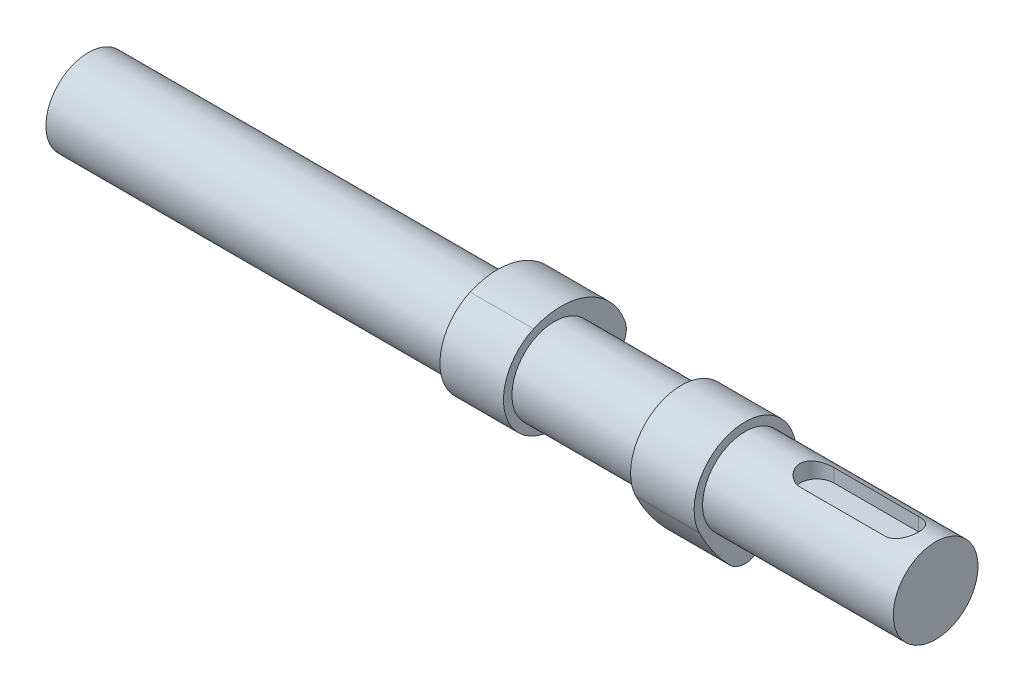
ISO-10303-21;
HEADER;
FILE_DESCRIPTION(('STEP AP214'),'2;1');
FILE_NAME('part.step','',(''),(''),'','','');
FILE_SCHEMA(('AUTOMOTIVE_DESIGN { 1 0 10303 214 1 1 1 1 }'));
ENDSEC;
DATA;
#1=APPLICATION_CONTEXT('core data for automotive mechanical design processes');
#2=APPLICATION_PROTOCOL_DEFINITION('international standard','automotive_design',2000,#1);
#3=PRODUCT_CONTEXT('',#1,'mechanical');
#4=PRODUCT('Part','Part','',(#3));
#5=PRODUCT_RELATED_PRODUCT_CATEGORY('part','',(#4));
#6=PRODUCT_DEFINITION_FORMATION('','',#4);
#7=PRODUCT_DEFINITION_CONTEXT('part definition',#1,'design');
#8=PRODUCT_DEFINITION('design','',#6,#7);
#9=PRODUCT_DEFINITION_SHAPE('','',#8);
#10=(LENGTH_UNIT() NAMED_UNIT(*) SI_UNIT(.MILLI.,.METRE.));
#11=(NAMED_UNIT(*) PLANE_ANGLE_UNIT() SI_UNIT($,.RADIAN.));
#12=(NAMED_UNIT(*) SI_UNIT($,.STERADIAN.) SOLID_ANGLE_UNIT());
#13=UNCERTAINTY_MEASURE_WITH_UNIT(LENGTH_MEASURE(1.E-05),#10,'distance_accuracy_value','');
#14=(GEOMETRIC_REPRESENTATION_CONTEXT(3) GLOBAL_UNCERTAINTY_ASSIGNED_CONTEXT((#13)) GLOBAL_UNIT_ASSIGNED_CONTEXT((#10,
#11,#12)) REPRESENTATION_CONTEXT('',''));
#15=CARTESIAN_POINT('',(0.,0.,0.));
#16=DIRECTION('',(0.,0.,1.));
#17=DIRECTION('',(1.,0.,0.));
#18=AXIS2_PLACEMENT_3D('',#15,#16,#17);
#19=CARTESIAN_POINT('',(30.,-1.62500000000004,3.65504787930334));
#20=DIRECTION('',(-1.,0.,0.));
#21=DIRECTION('',(0.,-1.,0.));
#22=AXIS2_PLACEMENT_3D('',#19,#20,#21);
#23=CYLINDRICAL_SURFACE('',#22,16.);
#24=CARTESIAN_POINT('',(15.,-1.62500000000004,3.65504787930334));
#25=DIRECTION('',(1.,0.,0.));
#26=DIRECTION('',(0.,1.,0.));
#27=AXIS2_PLACEMENT_3D('',#24,#25,#26);
#28=CIRCLE('',#27,16.);
#29=CARTESIAN_POINT('',(15.,-16.7159090909091,-1.66138539968352));
#30=VERTEX_POINT('',#29);
#31=CARTESIAN_POINT('',(15.,4.87500000000011,-10.96514363791));
#32=VERTEX_POINT('',#31);
#33=EDGE_CURVE('E118',#30,#32,#28,.T.);
#34=ORIENTED_EDGE('',*,*,#33,.T.);
#35=DIRECTION('',(-1.,0.,0.));
#36=VECTOR('',#35,1.);
#37=CARTESIAN_POINT('',(30.,4.87500000000011,-10.96514363791));
#38=LINE('',#37,#36);
#39=CARTESIAN_POINT('',(30.,4.87500000000011,-10.96514363791));
#40=VERTEX_POINT('',#39);
#41=EDGE_CURVE('E57',#40,#32,#38,.T.);
#42=ORIENTED_EDGE('',*,*,#41,.F.);
#43=CARTESIAN_POINT('',(30.,-1.62500000000004,3.65504787930334));
#44=DIRECTION('',(1.,0.,0.));
#45=DIRECTION('',(0.,1.,0.));
#46=AXIS2_PLACEMENT_3D('',#43,#44,#45);
#47=CIRCLE('',#46,16.);
#48=CARTESIAN_POINT('',(30.,-16.7159090909091,-1.66138539968352));
#49=VERTEX_POINT('',#48);
#50=EDGE_CURVE('E107',#49,#40,#47,.T.);
#51=ORIENTED_EDGE('',*,*,#50,.F.);
#52=DIRECTION('',(-1.,0.,0.));
#53=VECTOR('',#52,1.);
#54=CARTESIAN_POINT('',(30.,-16.7159090909091,-1.66138539968352));
#55=LINE('',#54,#53);
#56=EDGE_CURVE('E12',#49,#30,#55,.T.);
#57=ORIENTED_EDGE('',*,*,#56,.T.);
#58=EDGE_LOOP('',(#34,#42,#51,#57));
#59=FACE_BOUND('',#58,.T.);
#60=ADVANCED_FACE('F54',(#59),#23,.T.);
#61=CARTESIAN_POINT('',(30.,-12.,-1.25693328198353E-13));
#62=DIRECTION('',(-1.,0.,0.));
#63=DIRECTION('',(0.,-1.,0.));
#64=AXIS2_PLACEMENT_3D('',#61,#62,#63);
#65=CYLINDRICAL_SURFACE('',#64,5.);
#66=CARTESIAN_POINT('',(15.,-12.,-1.25693328198353E-13));
#67=DIRECTION('',(1.,0.,0.));
#68=DIRECTION('',(0.,-1.,0.));
#69=AXIS2_PLACEMENT_3D('',#66,#67,#68);
#70=CIRCLE('',#69,5.);
#71=CARTESIAN_POINT('',(15.,-15.4821428571429,3.5881305888231));
#72=VERTEX_POINT('',#71);
#73=EDGE_CURVE('E95',#72,#30,#70,.T.);
#74=ORIENTED_EDGE('',*,*,#73,.T.);
#75=ORIENTED_EDGE('',*,*,#56,.F.);
#76=CARTESIAN_POINT('',(30.,-12.,-1.25693328198353E-13));
#77=DIRECTION('',(1.,0.,0.));
#78=DIRECTION('',(0.,-1.,0.));
#79=AXIS2_PLACEMENT_3D('',#76,#77,#78);
#80=CIRCLE('',#79,5.);
#81=CARTESIAN_POINT('',(30.,-15.4821428571429,3.5881305888231));
#82=VERTEX_POINT('',#81);
#83=EDGE_CURVE('E72',#82,#49,#80,.T.);
#84=ORIENTED_EDGE('',*,*,#83,.F.);
#85=DIRECTION('',(-1.,0.,0.));
#86=VECTOR('',#85,1.);
#87=CARTESIAN_POINT('',(30.,-15.4821428571429,3.5881305888231));
#88=LINE('',#87,#86);
#89=EDGE_CURVE('E63',#82,#72,#88,.T.);
#90=ORIENTED_EDGE('',*,*,#89,.T.);
#91=EDGE_LOOP('',(#74,#75,#84,#90));
#92=FACE_BOUND('',#91,.T.);
#93=ADVANCED_FACE('F124',(#92),#65,.T.);
#94=CARTESIAN_POINT('',(30.,12.3750000000003,-25.1169141217625));
#95=DIRECTION('',(-1.,0.,0.));
#96=DIRECTION('',(0.,-1.,0.));
#97=AXIS2_PLACEMENT_3D('',#94,#95,#96);
#98=CYLINDRICAL_SURFACE('',#97,40.);
#99=CARTESIAN_POINT('',(15.,12.3750000000003,-25.1169141217625));
#100=DIRECTION('',(1.,0.,0.));
#101=DIRECTION('',(0.,-1.,0.));
#102=AXIS2_PLACEMENT_3D('',#99,#100,#101);
#103=CIRCLE('',#102,40.);
#104=CARTESIAN_POINT('',(15.,-5.30357142857153,10.7643917664697));
#105=VERTEX_POINT('',#104);
#106=EDGE_CURVE('E89',#105,#72,#103,.T.);
#107=ORIENTED_EDGE('',*,*,#106,.T.);
#108=ORIENTED_EDGE('',*,*,#89,.F.);
#109=CARTESIAN_POINT('',(30.,12.3750000000003,-25.1169141217625));
#110=DIRECTION('',(1.,0.,0.));
#111=DIRECTION('',(0.,-1.,0.));
#112=AXIS2_PLACEMENT_3D('',#109,#110,#111);
#113=CIRCLE('',#112,40.);
#114=CARTESIAN_POINT('',(30.,-5.30357142857153,10.7643917664697));
#115=VERTEX_POINT('',#114);
#116=EDGE_CURVE('E105',#115,#82,#113,.T.);
#117=ORIENTED_EDGE('',*,*,#116,.F.);
#118=DIRECTION('',(-1.,0.,0.));
#119=VECTOR('',#118,1.);
#120=CARTESIAN_POINT('',(30.,-5.30357142857153,10.7643917664697));
#121=LINE('',#120,#119);
#122=EDGE_CURVE('E110',#115,#105,#121,.T.);
#123=ORIENTED_EDGE('',*,*,#122,.T.);
#124=EDGE_LOOP('',(#107,#108,#117,#123));
#125=FACE_BOUND('',#124,.T.);
#126=ADVANCED_FACE('F113',(#125),#98,.T.);
#127=CARTESIAN_POINT('',(30.,0.,0.));
#128=DIRECTION('',(-1.,0.,0.));
#129=DIRECTION('',(0.,-1.,0.));
#130=AXIS2_PLACEMENT_3D('',#127,#128,#129);
#131=CYLINDRICAL_SURFACE('',#130,12.);
#132=CARTESIAN_POINT('',(15.,0.,0.));
#133=DIRECTION('',(1.,0.,0.));
#134=DIRECTION('',(0.,-1.,0.));
#135=AXIS2_PLACEMENT_3D('',#132,#133,#134);
#136=CIRCLE('',#135,12.);
#137=EDGE_CURVE('E112',#32,#105,#136,.T.);
#138=ORIENTED_EDGE('',*,*,#137,.T.);
#139=ORIENTED_EDGE('',*,*,#122,.F.);
#140=CARTESIAN_POINT('',(30.,0.,0.));
#141=DIRECTION('',(1.,0.,0.));
#142=DIRECTION('',(0.,-1.,0.));
#143=AXIS2_PLACEMENT_3D('',#140,#141,#142);
#144=CIRCLE('',#143,12.);
#145=EDGE_CURVE('E102',#40,#115,#144,.T.);
#146=ORIENTED_EDGE('',*,*,#145,.F.);
#147=ORIENTED_EDGE('',*,*,#41,.T.);
#148=EDGE_LOOP('',(#138,#139,#146,#147));
#149=FACE_BOUND('',#148,.T.);
#150=ADVANCED_FACE('F111',(#149),#131,.T.);
#151=CARTESIAN_POINT('',(30.,-6.81250000000002,1.82752393965161));
#152=DIRECTION('',(1.,0.,0.));
#153=DIRECTION('',(0.,1.,0.));
#154=AXIS2_PLACEMENT_3D('',#151,#152,#153);
#155=PLANE('',#154);
#156=ORIENTED_EDGE('',*,*,#50,.T.);
#157=ORIENTED_EDGE('',*,*,#145,.T.);
#158=ORIENTED_EDGE('',*,*,#116,.T.);
#159=ORIENTED_EDGE('',*,*,#83,.T.);
#160=EDGE_LOOP('',(#156,#157,#158,#159));
#161=FACE_BOUND('',#160,.T.);
#162=ADVANCED_FACE('F103',(#161),#155,.T.);
#163=CARTESIAN_POINT('',(15.,-6.81250000000002,1.82752393965161));
#164=DIRECTION('',(1.,0.,0.));
#165=DIRECTION('',(0.,1.,0.));
#166=AXIS2_PLACEMENT_3D('',#163,#164,#165);
#167=PLANE('',#166);
#168=ORIENTED_EDGE('',*,*,#33,.F.);
#169=ORIENTED_EDGE('',*,*,#73,.F.);
#170=ORIENTED_EDGE('',*,*,#106,.F.);
#171=ORIENTED_EDGE('',*,*,#137,.F.);
#172=EDGE_LOOP('',(#168,#169,#170,#171));
#173=FACE_BOUND('',#172,.T.);
#174=ADVANCED_FACE('F127',(#173),#167,.F.);
#175=CLOSED_SHELL('',(#60,#93,#126,#150,#162,#174));
#176=MANIFOLD_SOLID_BREP('B2',#175);
#177=CARTESIAN_POINT('',(-30.,-3.65504787930336,-1.625));
#178=DIRECTION('',(1.,0.,0.));
#179=DIRECTION('',(0.,0.,-1.));
#180=AXIS2_PLACEMENT_3D('',#177,#178,#179);
#181=CYLINDRICAL_SURFACE('',#180,16.);
#182=CARTESIAN_POINT('',(-15.,-3.65504787930336,-1.625));
#183=DIRECTION('',(1.,0.,0.));
#184=DIRECTION('',(0.,0.,1.));
#185=AXIS2_PLACEMENT_3D('',#182,#183,#184);
#186=CIRCLE('',#185,16.);
#187=CARTESIAN_POINT('',(-15.,1.66138539968335,-16.7159090909091));
#188=VERTEX_POINT('',#187);
#189=CARTESIAN_POINT('',(-15.,10.9651436379101,4.875));
#190=VERTEX_POINT('',#189);
#191=EDGE_CURVE('E251',#188,#190,#186,.T.);
#192=ORIENTED_EDGE('',*,*,#191,.F.);
#193=DIRECTION('',(1.,0.,0.));
#194=VECTOR('',#193,1.);
#195=CARTESIAN_POINT('',(-30.,1.66138539968335,-16.7159090909091));
#196=LINE('',#195,#194);
#197=CARTESIAN_POINT('',(-30.,1.66138539968335,-16.7159090909091));
#198=VERTEX_POINT('',#197);
#199=EDGE_CURVE('E52',#198,#188,#196,.T.);
#200=ORIENTED_EDGE('',*,*,#199,.F.);
#201=CARTESIAN_POINT('',(-30.,-3.65504787930336,-1.625));
#202=DIRECTION('',(1.,0.,0.));
#203=DIRECTION('',(0.,0.,1.));
#204=AXIS2_PLACEMENT_3D('',#201,#202,#203);
#205=CIRCLE('',#204,16.);
#206=CARTESIAN_POINT('',(-30.,10.9651436379101,4.875));
#207=VERTEX_POINT('',#206);
#208=EDGE_CURVE('E245',#198,#207,#205,.T.);
#209=ORIENTED_EDGE('',*,*,#208,.T.);
#210=DIRECTION('',(1.,0.,0.));
#211=VECTOR('',#210,1.);
#212=CARTESIAN_POINT('',(-30.,10.9651436379101,4.875));
#213=LINE('',#212,#211);
#214=EDGE_CURVE('E190',#207,#190,#213,.T.);
#215=ORIENTED_EDGE('',*,*,#214,.T.);
#216=EDGE_LOOP('',(#192,#200,#209,#215));
#217=FACE_BOUND('',#216,.T.);
#218=ADVANCED_FACE('F187',(#217),#181,.T.);
#219=CARTESIAN_POINT('',(-30.,0.,-12.));
#220=DIRECTION('',(1.,0.,0.));
#221=DIRECTION('',(0.,0.,-1.));
#222=AXIS2_PLACEMENT_3D('',#219,#220,#221);
#223=CYLINDRICAL_SURFACE('',#222,5.);
#224=CARTESIAN_POINT('',(-15.,0.,-12.));
#225=DIRECTION('',(1.,0.,0.));
#226=DIRECTION('',(0.,0.,-1.));
#227=AXIS2_PLACEMENT_3D('',#224,#225,#226);
#228=CIRCLE('',#227,5.);
#229=CARTESIAN_POINT('',(-15.,-3.58813058882326,-15.4821428571428));
#230=VERTEX_POINT('',#229);
#231=EDGE_CURVE('E247',#230,#188,#228,.T.);
#232=ORIENTED_EDGE('',*,*,#231,.F.);
#233=DIRECTION('',(1.,0.,0.));
#234=VECTOR('',#233,1.);
#235=CARTESIAN_POINT('',(-30.,-3.58813058882326,-15.4821428571428));
#236=LINE('',#235,#234);
#237=CARTESIAN_POINT('',(-30.,-3.58813058882326,-15.4821428571428));
#238=VERTEX_POINT('',#237);
#239=EDGE_CURVE('E196',#238,#230,#236,.T.);
#240=ORIENTED_EDGE('',*,*,#239,.F.);
#241=CARTESIAN_POINT('',(-30.,0.,-12.));
#242=DIRECTION('',(1.,0.,0.));
#243=DIRECTION('',(0.,0.,-1.));
#244=AXIS2_PLACEMENT_3D('',#241,#242,#243);
#245=CIRCLE('',#244,5.);
#246=EDGE_CURVE('E242',#238,#198,#245,.T.);
#247=ORIENTED_EDGE('',*,*,#246,.T.);
#248=ORIENTED_EDGE('',*,*,#199,.T.);
#249=EDGE_LOOP('',(#232,#240,#247,#248));
#250=FACE_BOUND('',#249,.T.);
#251=ADVANCED_FACE('F261',(#250),#223,.T.);
#252=CARTESIAN_POINT('',(-30.,25.1169141217626,12.375));
#253=DIRECTION('',(1.,0.,0.));
#254=DIRECTION('',(0.,0.,-1.));
#255=AXIS2_PLACEMENT_3D('',#252,#253,#254);
#256=CYLINDRICAL_SURFACE('',#255,40.);
#257=CARTESIAN_POINT('',(-15.,25.1169141217626,12.375));
#258=DIRECTION('',(1.,0.,0.));
#259=DIRECTION('',(0.,0.,-1.));
#260=AXIS2_PLACEMENT_3D('',#257,#258,#259);
#261=CIRCLE('',#260,40.);
#262=CARTESIAN_POINT('',(-15.,-10.7643917664697,-5.30357142857142));
#263=VERTEX_POINT('',#262);
#264=EDGE_CURVE('E237',#263,#230,#261,.T.);
#265=ORIENTED_EDGE('',*,*,#264,.F.);
#266=DIRECTION('',(1.,0.,0.));
#267=VECTOR('',#266,1.);
#268=CARTESIAN_POINT('',(-30.,-10.7643917664697,-5.30357142857142));
#269=LINE('',#268,#267);
#270=CARTESIAN_POINT('',(-30.,-10.7643917664697,-5.30357142857142));
#271=VERTEX_POINT('',#270);
#272=EDGE_CURVE('E232',#271,#263,#269,.T.);
#273=ORIENTED_EDGE('',*,*,#272,.F.);
#274=CARTESIAN_POINT('',(-30.,25.1169141217626,12.375));
#275=DIRECTION('',(1.,0.,0.));
#276=DIRECTION('',(0.,0.,-1.));
#277=AXIS2_PLACEMENT_3D('',#274,#275,#276);
#278=CIRCLE('',#277,40.);
#279=EDGE_CURVE('E235',#271,#238,#278,.T.);
#280=ORIENTED_EDGE('',*,*,#279,.T.);
#281=ORIENTED_EDGE('',*,*,#239,.T.);
#282=EDGE_LOOP('',(#265,#273,#280,#281));
#283=FACE_BOUND('',#282,.T.);
#284=ADVANCED_FACE('F234',(#283),#256,.T.);
#285=CARTESIAN_POINT('',(-30.,0.,0.));
#286=DIRECTION('',(1.,0.,0.));
#287=DIRECTION('',(0.,0.,-1.));
#288=AXIS2_PLACEMENT_3D('',#285,#286,#287);
#289=CYLINDRICAL_SURFACE('',#288,12.);
#290=CARTESIAN_POINT('',(-15.,0.,0.));
#291=DIRECTION('',(1.,0.,0.));
#292=DIRECTION('',(0.,0.,-1.));
#293=AXIS2_PLACEMENT_3D('',#290,#291,#292);
#294=CIRCLE('',#293,12.);
#295=EDGE_CURVE('E254',#190,#263,#294,.T.);
#296=ORIENTED_EDGE('',*,*,#295,.F.);
#297=ORIENTED_EDGE('',*,*,#214,.F.);
#298=CARTESIAN_POINT('',(-30.,0.,0.));
#299=DIRECTION('',(1.,0.,0.));
#300=DIRECTION('',(0.,0.,-1.));
#301=AXIS2_PLACEMENT_3D('',#298,#299,#300);
#302=CIRCLE('',#301,12.);
#303=EDGE_CURVE('E241',#207,#271,#302,.T.);
#304=ORIENTED_EDGE('',*,*,#303,.T.);
#305=ORIENTED_EDGE('',*,*,#272,.T.);
#306=EDGE_LOOP('',(#296,#297,#304,#305));
#307=FACE_BOUND('',#306,.T.);
#308=ADVANCED_FACE('F244',(#307),#289,.T.);
#309=CARTESIAN_POINT('',(-30.,-1.82752393965168,-6.8125));
#310=DIRECTION('',(-1.,0.,0.));
#311=DIRECTION('',(0.,0.,1.));
#312=AXIS2_PLACEMENT_3D('',#309,#310,#311);
#313=PLANE('',#312);
#314=ORIENTED_EDGE('',*,*,#208,.F.);
#315=ORIENTED_EDGE('',*,*,#246,.F.);
#316=ORIENTED_EDGE('',*,*,#279,.F.);
#317=ORIENTED_EDGE('',*,*,#303,.F.);
#318=EDGE_LOOP('',(#314,#315,#316,#317));
#319=FACE_BOUND('',#318,.T.);
#320=ADVANCED_FACE('F240',(#319),#313,.T.);
#321=CARTESIAN_POINT('',(-15.,-1.82752393965168,-6.8125));
#322=DIRECTION('',(-1.,0.,0.));
#323=DIRECTION('',(0.,0.,1.));
#324=AXIS2_PLACEMENT_3D('',#321,#322,#323);
#325=PLANE('',#324);
#326=ORIENTED_EDGE('',*,*,#191,.T.);
#327=ORIENTED_EDGE('',*,*,#295,.T.);
#328=ORIENTED_EDGE('',*,*,#264,.T.);
#329=ORIENTED_EDGE('',*,*,#231,.T.);
#330=EDGE_LOOP('',(#326,#327,#328,#329));
#331=FACE_BOUND('',#330,.T.);
#332=ADVANCED_FACE('F260',(#331),#325,.F.);
#333=CLOSED_SHELL('',(#218,#251,#284,#308,#320,#332));
#334=MANIFOLD_SOLID_BREP('B6',#333);
#335=CARTESIAN_POINT('',(-125.,0.,0.));
#336=DIRECTION('',(1.,0.,0.));
#337=DIRECTION('',(0.,0.,-1.));
#338=AXIS2_PLACEMENT_3D('',#335,#336,#337);
#339=CYLINDRICAL_SURFACE('',#338,10.);
#340=CARTESIAN_POINT('',(67.,9.16515138991168,4.));
#341=CARTESIAN_POINT('',(67.1076117050542,9.16512928809544,4.00001596071937));
#342=CARTESIAN_POINT('',(67.2152113311667,9.16704612011429,3.99565782731265));
#343=CARTESIAN_POINT('',(67.4295425965387,9.17459250745478,3.97831811946459));
#344=CARTESIAN_POINT('',(67.5362745507169,9.18022064873058,3.96533982937531));
#345=CARTESIAN_POINT('',(67.7476936431063,9.19499565865171,3.93095207352899));
#346=CARTESIAN_POINT('',(67.852387168085,9.20412861441611,3.90957593640916));
#347=CARTESIAN_POINT('',(68.0594015434319,9.22560106586818,3.85863260381273));
#348=CARTESIAN_POINT('',(68.1617222485551,9.23794075728508,3.82906490834148));
#349=CARTESIAN_POINT('',(68.4638717011625,9.2791858250141,3.72853943587112));
#350=CARTESIAN_POINT('',(68.6593084613828,9.3123489831615,3.64568978920222));
#351=CARTESIAN_POINT('',(69.0335911601619,9.38624741529469,3.45096383184147));
#352=CARTESIAN_POINT('',(69.2124211059086,9.42698987727425,3.33905992673094));
#353=CARTESIAN_POINT('',(69.558524793364,9.51401998804847,3.08263671474506));
#354=CARTESIAN_POINT('',(69.7247344339004,9.56048491272144,2.936738279885));
#355=CARTESIAN_POINT('',(70.0310805443615,9.65225581096199,2.61939292349377));
#356=CARTESIAN_POINT('',(70.1712116615072,9.69756154495612,2.44794076987998));
#357=CARTESIAN_POINT('',(70.4268127886244,9.78406834216144,2.07601181629753));
#358=CARTESIAN_POINT('',(70.5410896194101,9.82503649102096,1.87465586655102));
#359=CARTESIAN_POINT('',(70.7336881444914,9.89607888234979,1.45364828604453));
#360=CARTESIAN_POINT('',(70.8120248447933,9.92615767032247,1.23400433637531));
#361=CARTESIAN_POINT('',(70.9266824057709,9.97076629361036,0.793934884187374));
#362=CARTESIAN_POINT('',(70.9648539133031,9.98597845290694,0.574062114869026));
#363=CARTESIAN_POINT('',(71.0040569484035,10.001606202074,0.130536855092208));
#364=CARTESIAN_POINT('',(71.0051016332518,10.0020270338048,-0.0931142682526755));
#365=CARTESIAN_POINT('',(70.9710343620717,9.98843920775428,-0.52446673198723));
#366=CARTESIAN_POINT('',(70.9379500534468,9.97523973659776,-0.732358330632752));
#367=CARTESIAN_POINT('',(70.8400129990898,9.93698538393896,-1.13934964738689));
#368=CARTESIAN_POINT('',(70.7751584554296,9.91192983148495,-1.33844886722559));
#369=CARTESIAN_POINT('',(70.614727962228,9.85193670608706,-1.72579479688348));
#370=CARTESIAN_POINT('',(70.518703604161,9.81685584875391,-1.91383264586891));
#371=CARTESIAN_POINT('',(70.2990687362952,9.74029168639969,-2.2716159956307));
#372=CARTESIAN_POINT('',(70.1754485485622,9.69880613681324,-2.4413550479227));
#373=CARTESIAN_POINT('',(69.8947199425636,9.61043706268122,-2.7695225783069));
#374=CARTESIAN_POINT('',(69.7359469828836,9.56337795745419,-2.92647922614483));
#375=CARTESIAN_POINT('',(69.3940078633372,9.47123359153046,-3.2122147086262));
#376=CARTESIAN_POINT('',(69.2108306512004,9.42614923753061,-3.34098070594789));
#377=CARTESIAN_POINT('',(68.9183643543766,9.36326134539254,-3.51186134851389));
#378=CARTESIAN_POINT('',(68.8163281616851,9.34283170142194,-3.56571263251516));
#379=CARTESIAN_POINT('',(68.6076076975908,9.30450957703984,-3.6645476150566));
#380=CARTESIAN_POINT('',(68.5009254542727,9.28661600381593,-3.70953513634087));
#381=CARTESIAN_POINT('',(68.2837710695037,9.2540025053992,-3.79016254319008));
#382=CARTESIAN_POINT('',(68.1733038299586,9.2392786427695,-3.82581403809399));
#383=CARTESIAN_POINT('',(67.9493316318513,9.2135146773091,-3.88744848158464));
#384=CARTESIAN_POINT('',(67.8358280597875,9.20247292309662,-3.91343576505912));
#385=CARTESIAN_POINT('',(67.6025545526625,9.18417798205495,-3.95619393609846));
#386=CARTESIAN_POINT('',(67.4827058054362,9.17707470750586,-3.9726012558417));
#387=CARTESIAN_POINT('',(67.2419090708629,9.16754485606457,-3.99451448409732));
#388=CARTESIAN_POINT('',(67.1209618070773,9.16511539745838,-4.00002710996011));
#389=CARTESIAN_POINT('',(67.,9.16515138991168,-4.));
#390=B_SPLINE_CURVE_WITH_KNOTS('',3,(#340,#341,#342,#343,#344,#345,#346,#347,#348,#349,#350,
#351,#352,#353,#354,#355,#356,#357,#358,#359,#360,#361,#362,#363,#364,#365,#366,#367,#368,#369,
#370,#371,#372,#373,#374,#375,#376,#377,#378,#379,#380,#381,#382,#383,#384,#385,#386,#387,#388,
#389),.UNSPECIFIED.,.F.,.F.,(4,2,2,2,2,2,2,2,2,2,2,2,2,2,2,2,2,2,2,2,2,2,2,2,4),(0.,
0.322709706217834,0.645296527806424,0.96661582254376,1.28795473422461,1.92936600351818,
2.57138869889252,3.24636095994996,3.92147161082381,4.62325717855527,5.32474946398644,
5.99227753012539,6.65956903033311,7.2893783052307,7.91922322615308,8.55856353859092,
9.19812842270037,9.87963749353244,10.5614562641081,10.9125878460839,11.2635676597188,
11.614108935291,11.964492785171,12.3274303244848,12.6901440171997),.UNSPECIFIED.);
#391=CARTESIAN_POINT('',(67.,9.16515138991165,4.));
#392=VERTEX_POINT('',#391);
#393=CARTESIAN_POINT('',(67.,9.16515138991168,-4.));
#394=VERTEX_POINT('',#393);
#395=EDGE_CURVE('E397',#392,#394,#390,.T.);
#396=ORIENTED_EDGE('',*,*,#395,.F.);
#397=DIRECTION('',(1.,0.,0.));
#398=VECTOR('',#397,1.);
#399=CARTESIAN_POINT('',(-125.,9.16515138991165,4.00000000000006));
#400=LINE('',#399,#398);
#401=CARTESIAN_POINT('',(47.,9.16515138991168,4.));
#402=VERTEX_POINT('',#401);
#403=EDGE_CURVE('E185',#402,#392,#400,.T.);
#404=ORIENTED_EDGE('',*,*,#403,.F.);
#405=CARTESIAN_POINT('',(47.,9.16515138991168,-4.));
#406=CARTESIAN_POINT('',(46.8923882949459,9.16512928809544,-4.00001596071937));
#407=CARTESIAN_POINT('',(46.7847886688333,9.16704612011429,-3.99565782731265));
#408=CARTESIAN_POINT('',(46.5704574034613,9.17459250745478,-3.9783181194646));
#409=CARTESIAN_POINT('',(46.4637254492831,9.18022064873058,-3.96533982937531));
#410=CARTESIAN_POINT('',(46.2523063568937,9.19499565865171,-3.93095207352899));
#411=CARTESIAN_POINT('',(46.147612831915,9.20412861441611,-3.90957593640916));
#412=CARTESIAN_POINT('',(45.9405984565681,9.22560106586818,-3.85863260381273));
#413=CARTESIAN_POINT('',(45.8382777514449,9.23794075728508,-3.82906490834147));
#414=CARTESIAN_POINT('',(45.5361282988375,9.2791858250141,-3.72853943587111));
#415=CARTESIAN_POINT('',(45.3406915386172,9.3123489831615,-3.64568978920222));
#416=CARTESIAN_POINT('',(44.9664088398381,9.38624741529469,-3.45096383184147));
#417=CARTESIAN_POINT('',(44.7875788940914,9.42698987727426,-3.33905992673093));
#418=CARTESIAN_POINT('',(44.441475206636,9.51401998804847,-3.08263671474505));
#419=CARTESIAN_POINT('',(44.2752655660996,9.56048491272144,-2.936738279885));
#420=CARTESIAN_POINT('',(43.9689194556385,9.65225581096199,-2.61939292349377));
#421=CARTESIAN_POINT('',(43.8287883384928,9.69756154495612,-2.44794076987997));
#422=CARTESIAN_POINT('',(43.5731872113755,9.78406834216145,-2.07601181629752));
#423=CARTESIAN_POINT('',(43.4589103805898,9.82503649102096,-1.87465586655101));
#424=CARTESIAN_POINT('',(43.2663118555086,9.89607888234979,-1.45364828604452));
#425=CARTESIAN_POINT('',(43.1879751552067,9.92615767032247,-1.2340043363753));
#426=CARTESIAN_POINT('',(43.0733175942291,9.97076629361036,-0.793934884187364));
#427=CARTESIAN_POINT('',(43.0351460866969,9.98597845290694,-0.574062114869015));
#428=CARTESIAN_POINT('',(42.9959430515965,10.001606202074,-0.130536855092197));
#429=CARTESIAN_POINT('',(42.9948983667482,10.0020270338048,0.0931142682526862));
#430=CARTESIAN_POINT('',(43.0289656379282,9.98843920775428,0.524466731987239));
#431=CARTESIAN_POINT('',(43.0620499465532,9.97523973659776,0.732358330632759));
#432=CARTESIAN_POINT('',(43.1599870009102,9.93698538393896,1.13934964738689));
#433=CARTESIAN_POINT('',(43.2248415445704,9.91192983148495,1.33844886722559));
#434=CARTESIAN_POINT('',(43.3852720377719,9.85193670608706,1.72579479688349));
#435=CARTESIAN_POINT('',(43.4812963958391,9.81685584875391,1.91383264586892));
#436=CARTESIAN_POINT('',(43.7009312637048,9.74029168639969,2.27161599563072));
#437=CARTESIAN_POINT('',(43.8245514514379,9.69880613681324,2.44135504792271));
#438=CARTESIAN_POINT('',(44.1052800574364,9.61043706268122,2.76952257830691));
#439=CARTESIAN_POINT('',(44.2640530171164,9.56337795745419,2.92647922614484));
#440=CARTESIAN_POINT('',(44.6059921366628,9.47123359153046,3.21221470862621));
#441=CARTESIAN_POINT('',(44.7891693487996,9.42614923753061,3.34098070594789));
#442=CARTESIAN_POINT('',(45.0816356456234,9.36326134539254,3.5118613485139));
#443=CARTESIAN_POINT('',(45.1836718383149,9.34283170142194,3.56571263251516));
#444=CARTESIAN_POINT('',(45.3923923024092,9.30450957703984,3.6645476150566));
#445=CARTESIAN_POINT('',(45.4990745457273,9.28661600381593,3.70953513634087));
#446=CARTESIAN_POINT('',(45.7162289304963,9.2540025053992,3.79016254319008));
#447=CARTESIAN_POINT('',(45.8266961700414,9.2392786427695,3.82581403809399));
#448=CARTESIAN_POINT('',(46.0506683681487,9.2135146773091,3.88744848158464));
#449=CARTESIAN_POINT('',(46.1641719402126,9.20247292309662,3.91343576505912));
#450=CARTESIAN_POINT('',(46.3974454473375,9.18417798205494,3.95619393609846));
#451=CARTESIAN_POINT('',(46.5172941945638,9.17707470750586,3.9726012558417));
#452=CARTESIAN_POINT('',(46.758090929137,9.16754485606457,3.99451448409732));
#453=CARTESIAN_POINT('',(46.8790381929227,9.16511539745838,4.00002710996011));
#454=CARTESIAN_POINT('',(47.,9.16515138991168,4.));
#455=B_SPLINE_CURVE_WITH_KNOTS('',3,(#405,#406,#407,#408,#409,#410,#411,#412,#413,#414,#415,
#416,#417,#418,#419,#420,#421,#422,#423,#424,#425,#426,#427,#428,#429,#430,#431,#432,#433,#434,
#435,#436,#437,#438,#439,#440,#441,#442,#443,#444,#445,#446,#447,#448,#449,#450,#451,#452,#453,
#454),.UNSPECIFIED.,.F.,.F.,(4,2,2,2,2,2,2,2,2,2,2,2,2,2,2,2,2,2,2,2,2,2,2,2,4),(0.,
0.322709706217834,0.645296527806424,0.966615822543768,1.28795473422462,1.92936600351819,
2.57138869889253,3.24636095994997,3.92147161082383,4.62325717855528,5.32474946398646,
5.9922775301254,6.65956903033312,7.28937830523071,7.91922322615309,8.55856353859094,
9.19812842270039,9.87963749353245,10.5614562641081,10.9125878460839,11.2635676597188,
11.614108935291,11.964492785171,12.3274303244848,12.6901440171997),.UNSPECIFIED.);
#456=CARTESIAN_POINT('',(47.,9.1651513899117,-4.));
#457=VERTEX_POINT('',#456);
#458=EDGE_CURVE('E320',#457,#402,#455,.T.);
#459=ORIENTED_EDGE('',*,*,#458,.F.);
#460=DIRECTION('',(1.,0.,0.));
#461=VECTOR('',#460,1.);
#462=CARTESIAN_POINT('',(-125.,9.1651513899117,-3.99999999999996));
#463=LINE('',#462,#461);
#464=EDGE_CURVE('E405',#394,#457,#463,.F.);
#465=ORIENTED_EDGE('',*,*,#464,.F.);
#466=EDGE_LOOP('',(#396,#404,#459,#465));
#467=FACE_BOUND('',#466,.T.);
#468=CARTESIAN_POINT('',(-125.,0.,0.));
#469=DIRECTION('',(1.,0.,0.));
#470=DIRECTION('',(0.,0.,-1.));
#471=AXIS2_PLACEMENT_3D('',#468,#469,#470);
#472=CIRCLE('',#471,10.);
#473=CARTESIAN_POINT('',(-125.,0.,-10.));
#474=VERTEX_POINT('',#473);
#475=EDGE_CURVE('E393',#474,#474,#472,.T.);
#476=ORIENTED_EDGE('',*,*,#475,.T.);
#477=EDGE_LOOP('',(#476));
#478=FACE_BOUND('',#477,.T.);
#479=CARTESIAN_POINT('',(75.,0.,0.));
#480=DIRECTION('',(1.,0.,0.));
#481=DIRECTION('',(0.,0.,-1.));
#482=AXIS2_PLACEMENT_3D('',#479,#480,#481);
#483=CIRCLE('',#482,10.);
#484=CARTESIAN_POINT('',(75.,0.,-10.));
#485=VERTEX_POINT('',#484);
#486=EDGE_CURVE('E383',#485,#485,#483,.T.);
#487=ORIENTED_EDGE('',*,*,#486,.F.);
#488=EDGE_LOOP('',(#487));
#489=FACE_BOUND('',#488,.T.);
#490=ADVANCED_FACE('F311',(#467,#478,#489),#339,.T.);
#491=CARTESIAN_POINT('',(-125.,0.,0.));
#492=DIRECTION('',(1.,0.,0.));
#493=DIRECTION('',(0.,0.,-1.));
#494=AXIS2_PLACEMENT_3D('',#491,#492,#493);
#495=PLANE('',#494);
#496=ORIENTED_EDGE('',*,*,#475,.F.);
#497=EDGE_LOOP('',(#496));
#498=FACE_BOUND('',#497,.T.);
#499=ADVANCED_FACE('F429',(#498),#495,.F.);
#500=CARTESIAN_POINT('',(75.,0.,0.));
#501=DIRECTION('',(1.,0.,0.));
#502=DIRECTION('',(0.,0.,-1.));
#503=AXIS2_PLACEMENT_3D('',#500,#501,#502);
#504=PLANE('',#503);
#505=ORIENTED_EDGE('',*,*,#486,.T.);
#506=EDGE_LOOP('',(#505));
#507=FACE_BOUND('',#506,.T.);
#508=ADVANCED_FACE('F419',(#507),#504,.T.);
#509=CARTESIAN_POINT('',(47.,6.,0.));
#510=DIRECTION('',(0.,1.,0.));
#511=DIRECTION('',(0.,0.,1.));
#512=AXIS2_PLACEMENT_3D('',#509,#510,#511);
#513=CYLINDRICAL_SURFACE('',#512,4.);
#514=DIRECTION('',(0.,1.,0.));
#515=VECTOR('',#514,1.);
#516=CARTESIAN_POINT('',(47.,6.,-4.));
#517=LINE('',#516,#515);
#518=CARTESIAN_POINT('',(47.,6.,-4.));
#519=VERTEX_POINT('',#518);
#520=EDGE_CURVE('E380',#519,#457,#517,.T.);
#521=ORIENTED_EDGE('',*,*,#520,.T.);
#522=ORIENTED_EDGE('',*,*,#458,.T.);
#523=DIRECTION('',(0.,1.,0.));
#524=VECTOR('',#523,1.);
#525=CARTESIAN_POINT('',(47.,6.,4.));
#526=LINE('',#525,#524);
#527=CARTESIAN_POINT('',(47.,6.,4.));
#528=VERTEX_POINT('',#527);
#529=EDGE_CURVE('E326',#528,#402,#526,.T.);
#530=ORIENTED_EDGE('',*,*,#529,.F.);
#531=CARTESIAN_POINT('',(47.,6.,0.));
#532=DIRECTION('',(0.,1.,0.));
#533=DIRECTION('',(0.,0.,1.));
#534=AXIS2_PLACEMENT_3D('',#531,#532,#533);
#535=CIRCLE('',#534,4.);
#536=EDGE_CURVE('E355',#519,#528,#535,.T.);
#537=ORIENTED_EDGE('',*,*,#536,.F.);
#538=EDGE_LOOP('',(#521,#522,#530,#537));
#539=FACE_BOUND('',#538,.T.);
#540=ADVANCED_FACE('F353',(#539),#513,.F.);
#541=CARTESIAN_POINT('',(47.,6.,-4.));
#542=DIRECTION('',(0.,0.,-1.));
#543=DIRECTION('',(-1.,0.,0.));
#544=AXIS2_PLACEMENT_3D('',#541,#542,#543);
#545=PLANE('',#544);
#546=ORIENTED_EDGE('',*,*,#464,.T.);
#547=ORIENTED_EDGE('',*,*,#520,.F.);
#548=DIRECTION('',(-1.,0.,0.));
#549=VECTOR('',#548,1.);
#550=CARTESIAN_POINT('',(47.,6.,-4.));
#551=LINE('',#550,#549);
#552=CARTESIAN_POINT('',(67.,6.,-4.));
#553=VERTEX_POINT('',#552);
#554=EDGE_CURVE('E359',#553,#519,#551,.T.);
#555=ORIENTED_EDGE('',*,*,#554,.F.);
#556=DIRECTION('',(0.,1.,0.));
#557=VECTOR('',#556,1.);
#558=CARTESIAN_POINT('',(67.,6.,-4.));
#559=LINE('',#558,#557);
#560=EDGE_CURVE('E384',#553,#394,#559,.T.);
#561=ORIENTED_EDGE('',*,*,#560,.T.);
#562=EDGE_LOOP('',(#546,#547,#555,#561));
#563=FACE_BOUND('',#562,.T.);
#564=ADVANCED_FACE('F411',(#563),#545,.F.);
#565=CARTESIAN_POINT('',(67.,6.,0.));
#566=DIRECTION('',(0.,1.,0.));
#567=DIRECTION('',(0.,0.,1.));
#568=AXIS2_PLACEMENT_3D('',#565,#566,#567);
#569=CYLINDRICAL_SURFACE('',#568,4.);
#570=DIRECTION('',(0.,1.,0.));
#571=VECTOR('',#570,1.);
#572=CARTESIAN_POINT('',(67.,6.,4.));
#573=LINE('',#572,#571);
#574=CARTESIAN_POINT('',(67.,6.,4.));
#575=VERTEX_POINT('',#574);
#576=EDGE_CURVE('E358',#575,#392,#573,.T.);
#577=ORIENTED_EDGE('',*,*,#576,.T.);
#578=ORIENTED_EDGE('',*,*,#395,.T.);
#579=ORIENTED_EDGE('',*,*,#560,.F.);
#580=CARTESIAN_POINT('',(67.,6.,0.));
#581=DIRECTION('',(0.,1.,0.));
#582=DIRECTION('',(0.,0.,1.));
#583=AXIS2_PLACEMENT_3D('',#580,#581,#582);
#584=CIRCLE('',#583,4.);
#585=EDGE_CURVE('E369',#575,#553,#584,.T.);
#586=ORIENTED_EDGE('',*,*,#585,.F.);
#587=EDGE_LOOP('',(#577,#578,#579,#586));
#588=FACE_BOUND('',#587,.T.);
#589=ADVANCED_FACE('F406',(#588),#569,.F.);
#590=CARTESIAN_POINT('',(47.,6.,4.));
#591=DIRECTION('',(0.,0.,1.));
#592=DIRECTION('',(1.,0.,0.));
#593=AXIS2_PLACEMENT_3D('',#590,#591,#592);
#594=PLANE('',#593);
#595=ORIENTED_EDGE('',*,*,#403,.T.);
#596=ORIENTED_EDGE('',*,*,#576,.F.);
#597=DIRECTION('',(1.,0.,0.));
#598=VECTOR('',#597,1.);
#599=CARTESIAN_POINT('',(47.,6.,4.));
#600=LINE('',#599,#598);
#601=EDGE_CURVE('E362',#528,#575,#600,.T.);
#602=ORIENTED_EDGE('',*,*,#601,.F.);
#603=ORIENTED_EDGE('',*,*,#529,.T.);
#604=EDGE_LOOP('',(#595,#596,#602,#603));
#605=FACE_BOUND('',#604,.T.);
#606=ADVANCED_FACE('F363',(#605),#594,.F.);
#607=CARTESIAN_POINT('',(47.,6.,0.));
#608=DIRECTION('',(0.,1.,0.));
#609=DIRECTION('',(0.,0.,1.));
#610=AXIS2_PLACEMENT_3D('',#607,#608,#609);
#611=PLANE('',#610);
#612=ORIENTED_EDGE('',*,*,#536,.T.);
#613=ORIENTED_EDGE('',*,*,#601,.T.);
#614=ORIENTED_EDGE('',*,*,#585,.T.);
#615=ORIENTED_EDGE('',*,*,#554,.T.);
#616=EDGE_LOOP('',(#612,#613,#614,#615));
#617=FACE_BOUND('',#616,.T.);
#618=ADVANCED_FACE('F371',(#617),#611,.T.);
#619=CLOSED_SHELL('',(#490,#499,#508,#540,#564,#589,#606,#618));
#620=MANIFOLD_SOLID_BREP('B46',#619);
#621=ADVANCED_BREP_SHAPE_REPRESENTATION('',(#18,#176,#334,#620),#14);
#622=SHAPE_DEFINITION_REPRESENTATION(#9,#621);
ENDSEC;
END-ISO-10303-21;
